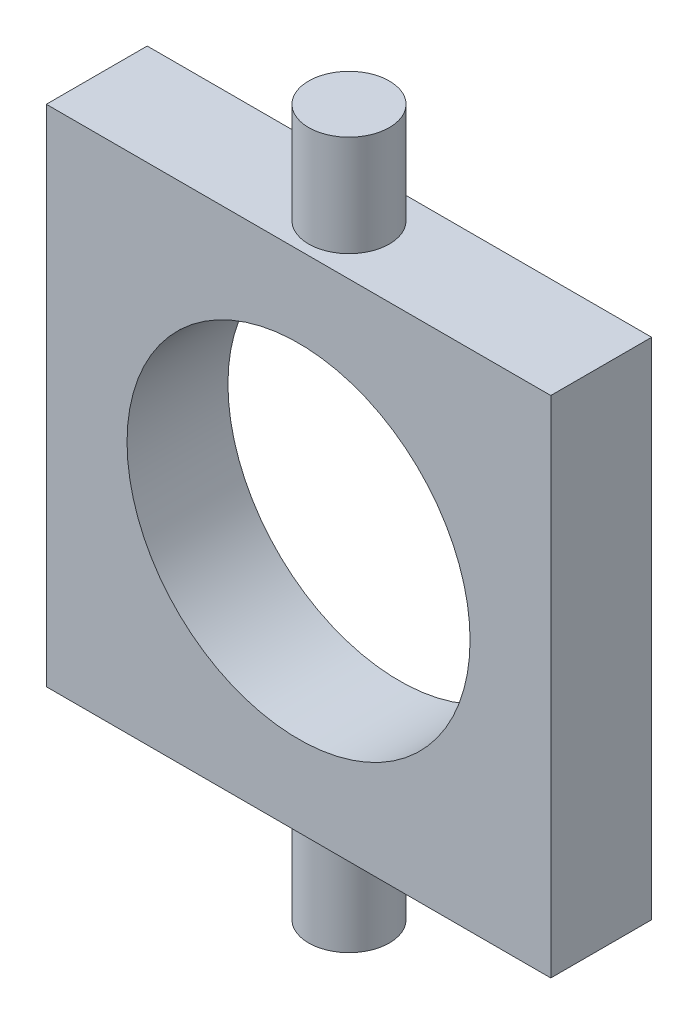
ISO-10303-21;
HEADER;
FILE_DESCRIPTION(('STEP AP214'),'2;1');
FILE_NAME('part.step','',(''),(''),'','','');
FILE_SCHEMA(('AUTOMOTIVE_DESIGN { 1 0 10303 214 1 1 1 1 }'));
ENDSEC;
DATA;
#1=APPLICATION_CONTEXT('core data for automotive mechanical design processes');
#2=APPLICATION_PROTOCOL_DEFINITION('international standard','automotive_design',2000,#1);
#3=PRODUCT_CONTEXT('',#1,'mechanical');
#4=PRODUCT('Part','Part','',(#3));
#5=PRODUCT_RELATED_PRODUCT_CATEGORY('part','',(#4));
#6=PRODUCT_DEFINITION_FORMATION('','',#4);
#7=PRODUCT_DEFINITION_CONTEXT('part definition',#1,'design');
#8=PRODUCT_DEFINITION('design','',#6,#7);
#9=PRODUCT_DEFINITION_SHAPE('','',#8);
#10=(LENGTH_UNIT() NAMED_UNIT(*) SI_UNIT(.MILLI.,.METRE.));
#11=(NAMED_UNIT(*) PLANE_ANGLE_UNIT() SI_UNIT($,.RADIAN.));
#12=(NAMED_UNIT(*) SI_UNIT($,.STERADIAN.) SOLID_ANGLE_UNIT());
#13=UNCERTAINTY_MEASURE_WITH_UNIT(LENGTH_MEASURE(1.E-05),#10,'distance_accuracy_value','');
#14=(GEOMETRIC_REPRESENTATION_CONTEXT(3) GLOBAL_UNCERTAINTY_ASSIGNED_CONTEXT((#13)) GLOBAL_UNIT_ASSIGNED_CONTEXT((#10,
#11,#12)) REPRESENTATION_CONTEXT('',''));
#15=CARTESIAN_POINT('',(0.,0.,0.));
#16=DIRECTION('',(0.,0.,1.));
#17=DIRECTION('',(1.,0.,0.));
#18=AXIS2_PLACEMENT_3D('',#15,#16,#17);
#19=CARTESIAN_POINT('',(25.,25.,10.));
#20=DIRECTION('',(-1.,0.,0.));
#21=DIRECTION('',(0.,-1.,0.));
#22=AXIS2_PLACEMENT_3D('',#19,#20,#21);
#23=PLANE('',#22);
#24=DIRECTION('',(0.,1.,0.));
#25=VECTOR('',#24,1.);
#26=CARTESIAN_POINT('',(25.,25.,0.));
#27=LINE('',#26,#25);
#28=CARTESIAN_POINT('',(25.,-25.,0.));
#29=VERTEX_POINT('',#28);
#30=CARTESIAN_POINT('',(25.,25.,0.));
#31=VERTEX_POINT('',#30);
#32=EDGE_CURVE('E99',#29,#31,#27,.T.);
#33=ORIENTED_EDGE('',*,*,#32,.T.);
#34=DIRECTION('',(0.,0.,-1.));
#35=VECTOR('',#34,1.);
#36=CARTESIAN_POINT('',(25.,25.,10.));
#37=LINE('',#36,#35);
#38=CARTESIAN_POINT('',(25.,25.,10.));
#39=VERTEX_POINT('',#38);
#40=EDGE_CURVE('E36',#39,#31,#37,.T.);
#41=ORIENTED_EDGE('',*,*,#40,.F.);
#42=DIRECTION('',(0.,1.,0.));
#43=VECTOR('',#42,1.);
#44=CARTESIAN_POINT('',(25.,25.,10.));
#45=LINE('',#44,#43);
#46=CARTESIAN_POINT('',(25.,-25.,10.));
#47=VERTEX_POINT('',#46);
#48=EDGE_CURVE('E86',#47,#39,#45,.T.);
#49=ORIENTED_EDGE('',*,*,#48,.F.);
#50=DIRECTION('',(0.,0.,-1.));
#51=VECTOR('',#50,1.);
#52=CARTESIAN_POINT('',(25.,-25.,10.));
#53=LINE('',#52,#51);
#54=EDGE_CURVE('E95',#47,#29,#53,.T.);
#55=ORIENTED_EDGE('',*,*,#54,.T.);
#56=EDGE_LOOP('',(#33,#41,#49,#55));
#57=FACE_BOUND('',#56,.T.);
#58=ADVANCED_FACE('F33',(#57),#23,.F.);
#59=CARTESIAN_POINT('',(-25.,25.,10.));
#60=DIRECTION('',(0.,-1.,0.));
#61=DIRECTION('',(0.,0.,-1.));
#62=AXIS2_PLACEMENT_3D('',#59,#60,#61);
#63=PLANE('',#62);
#64=CARTESIAN_POINT('',(0.,25.,5.));
#65=DIRECTION('',(0.,1.,0.));
#66=DIRECTION('',(0.,0.,1.));
#67=AXIS2_PLACEMENT_3D('',#64,#65,#66);
#68=CIRCLE('',#67,4.);
#69=CARTESIAN_POINT('',(0.,25.,9.));
#70=VERTEX_POINT('',#69);
#71=EDGE_CURVE('E11',#70,#70,#68,.T.);
#72=ORIENTED_EDGE('',*,*,#71,.F.);
#73=EDGE_LOOP('',(#72));
#74=FACE_BOUND('',#73,.T.);
#75=DIRECTION('',(-1.,0.,0.));
#76=VECTOR('',#75,1.);
#77=CARTESIAN_POINT('',(-25.,25.,0.));
#78=LINE('',#77,#76);
#79=CARTESIAN_POINT('',(-25.,25.,0.));
#80=VERTEX_POINT('',#79);
#81=EDGE_CURVE('E91',#31,#80,#78,.T.);
#82=ORIENTED_EDGE('',*,*,#81,.T.);
#83=DIRECTION('',(0.,0.,-1.));
#84=VECTOR('',#83,1.);
#85=CARTESIAN_POINT('',(-25.,25.,10.));
#86=LINE('',#85,#84);
#87=CARTESIAN_POINT('',(-25.,25.,10.));
#88=VERTEX_POINT('',#87);
#89=EDGE_CURVE('E89',#88,#80,#86,.T.);
#90=ORIENTED_EDGE('',*,*,#89,.F.);
#91=DIRECTION('',(-1.,0.,0.));
#92=VECTOR('',#91,1.);
#93=CARTESIAN_POINT('',(-25.,25.,10.));
#94=LINE('',#93,#92);
#95=EDGE_CURVE('E81',#39,#88,#94,.T.);
#96=ORIENTED_EDGE('',*,*,#95,.F.);
#97=ORIENTED_EDGE('',*,*,#40,.T.);
#98=EDGE_LOOP('',(#82,#90,#96,#97));
#99=FACE_BOUND('',#98,.T.);
#100=ADVANCED_FACE('F90',(#74,#99),#63,.F.);
#101=CARTESIAN_POINT('',(-25.,25.,10.));
#102=DIRECTION('',(1.,0.,0.));
#103=DIRECTION('',(0.,1.,0.));
#104=AXIS2_PLACEMENT_3D('',#101,#102,#103);
#105=PLANE('',#104);
#106=DIRECTION('',(0.,-1.,0.));
#107=VECTOR('',#106,1.);
#108=CARTESIAN_POINT('',(-25.,25.,0.));
#109=LINE('',#108,#107);
#110=CARTESIAN_POINT('',(-25.,-25.,0.));
#111=VERTEX_POINT('',#110);
#112=EDGE_CURVE('E67',#80,#111,#109,.T.);
#113=ORIENTED_EDGE('',*,*,#112,.T.);
#114=DIRECTION('',(0.,0.,-1.));
#115=VECTOR('',#114,1.);
#116=CARTESIAN_POINT('',(-25.,-25.,10.));
#117=LINE('',#116,#115);
#118=CARTESIAN_POINT('',(-25.,-25.,10.));
#119=VERTEX_POINT('',#118);
#120=EDGE_CURVE('E92',#119,#111,#117,.T.);
#121=ORIENTED_EDGE('',*,*,#120,.F.);
#122=DIRECTION('',(0.,-1.,0.));
#123=VECTOR('',#122,1.);
#124=CARTESIAN_POINT('',(-25.,25.,10.));
#125=LINE('',#124,#123);
#126=EDGE_CURVE('E84',#88,#119,#125,.T.);
#127=ORIENTED_EDGE('',*,*,#126,.F.);
#128=ORIENTED_EDGE('',*,*,#89,.T.);
#129=EDGE_LOOP('',(#113,#121,#127,#128));
#130=FACE_BOUND('',#129,.T.);
#131=ADVANCED_FACE('F93',(#130),#105,.F.);
#132=CARTESIAN_POINT('',(-25.,-25.,10.));
#133=DIRECTION('',(0.,1.,0.));
#134=DIRECTION('',(0.,0.,1.));
#135=AXIS2_PLACEMENT_3D('',#132,#133,#134);
#136=PLANE('',#135);
#137=CARTESIAN_POINT('',(0.,-25.,5.));
#138=DIRECTION('',(0.,1.,0.));
#139=DIRECTION('',(0.,0.,1.));
#140=AXIS2_PLACEMENT_3D('',#137,#138,#139);
#141=CIRCLE('',#140,4.);
#142=CARTESIAN_POINT('',(0.,-25.,9.));
#143=VERTEX_POINT('',#142);
#144=EDGE_CURVE('E122',#143,#143,#141,.T.);
#145=ORIENTED_EDGE('',*,*,#144,.T.);
#146=EDGE_LOOP('',(#145));
#147=FACE_BOUND('',#146,.T.);
#148=DIRECTION('',(1.,0.,0.));
#149=VECTOR('',#148,1.);
#150=CARTESIAN_POINT('',(-25.,-25.,0.));
#151=LINE('',#150,#149);
#152=EDGE_CURVE('E73',#111,#29,#151,.T.);
#153=ORIENTED_EDGE('',*,*,#152,.T.);
#154=ORIENTED_EDGE('',*,*,#54,.F.);
#155=DIRECTION('',(1.,0.,0.));
#156=VECTOR('',#155,1.);
#157=CARTESIAN_POINT('',(-25.,-25.,10.));
#158=LINE('',#157,#156);
#159=EDGE_CURVE('E50',#119,#47,#158,.T.);
#160=ORIENTED_EDGE('',*,*,#159,.F.);
#161=ORIENTED_EDGE('',*,*,#120,.T.);
#162=EDGE_LOOP('',(#153,#154,#160,#161));
#163=FACE_BOUND('',#162,.T.);
#164=ADVANCED_FACE('F107',(#147,#163),#136,.F.);
#165=CARTESIAN_POINT('',(0.,0.,10.));
#166=DIRECTION('',(0.,0.,1.));
#167=DIRECTION('',(1.,0.,0.));
#168=AXIS2_PLACEMENT_3D('',#165,#166,#167);
#169=PLANE('',#168);
#170=CARTESIAN_POINT('',(0.,0.,10.));
#171=DIRECTION('',(0.,0.,1.));
#172=DIRECTION('',(1.,0.,0.));
#173=AXIS2_PLACEMENT_3D('',#170,#171,#172);
#174=CIRCLE('',#173,17.);
#175=CARTESIAN_POINT('',(17.,0.,10.));
#176=VERTEX_POINT('',#175);
#177=EDGE_CURVE('E113',#176,#176,#174,.T.);
#178=ORIENTED_EDGE('',*,*,#177,.F.);
#179=EDGE_LOOP('',(#178));
#180=FACE_BOUND('',#179,.T.);
#181=ORIENTED_EDGE('',*,*,#48,.T.);
#182=ORIENTED_EDGE('',*,*,#95,.T.);
#183=ORIENTED_EDGE('',*,*,#126,.T.);
#184=ORIENTED_EDGE('',*,*,#159,.T.);
#185=EDGE_LOOP('',(#181,#182,#183,#184));
#186=FACE_BOUND('',#185,.T.);
#187=ADVANCED_FACE('F82',(#180,#186),#169,.T.);
#188=CARTESIAN_POINT('',(0.,0.,0.));
#189=DIRECTION('',(0.,0.,1.));
#190=DIRECTION('',(1.,0.,0.));
#191=AXIS2_PLACEMENT_3D('',#188,#189,#190);
#192=PLANE('',#191);
#193=CARTESIAN_POINT('',(0.,0.,0.));
#194=DIRECTION('',(0.,0.,1.));
#195=DIRECTION('',(1.,0.,0.));
#196=AXIS2_PLACEMENT_3D('',#193,#194,#195);
#197=CIRCLE('',#196,17.);
#198=CARTESIAN_POINT('',(17.,0.,0.));
#199=VERTEX_POINT('',#198);
#200=EDGE_CURVE('E102',#199,#199,#197,.T.);
#201=ORIENTED_EDGE('',*,*,#200,.T.);
#202=EDGE_LOOP('',(#201));
#203=FACE_BOUND('',#202,.T.);
#204=ORIENTED_EDGE('',*,*,#32,.F.);
#205=ORIENTED_EDGE('',*,*,#152,.F.);
#206=ORIENTED_EDGE('',*,*,#112,.F.);
#207=ORIENTED_EDGE('',*,*,#81,.F.);
#208=EDGE_LOOP('',(#204,#205,#206,#207));
#209=FACE_BOUND('',#208,.T.);
#210=ADVANCED_FACE('F110',(#203,#209),#192,.F.);
#211=CARTESIAN_POINT('',(0.,0.,0.));
#212=DIRECTION('',(0.,0.,1.));
#213=DIRECTION('',(1.,0.,0.));
#214=AXIS2_PLACEMENT_3D('',#211,#212,#213);
#215=CYLINDRICAL_SURFACE('',#214,17.);
#216=ORIENTED_EDGE('',*,*,#200,.F.);
#217=EDGE_LOOP('',(#216));
#218=FACE_BOUND('',#217,.T.);
#219=ORIENTED_EDGE('',*,*,#177,.T.);
#220=EDGE_LOOP('',(#219));
#221=FACE_BOUND('',#220,.T.);
#222=ADVANCED_FACE('F155',(#218,#221),#215,.F.);
#223=CARTESIAN_POINT('',(0.,35.,5.));
#224=DIRECTION('',(0.,-1.,0.));
#225=DIRECTION('',(0.,0.,-1.));
#226=AXIS2_PLACEMENT_3D('',#223,#224,#225);
#227=CYLINDRICAL_SURFACE('',#226,4.);
#228=CARTESIAN_POINT('',(0.,35.,5.));
#229=DIRECTION('',(0.,1.,0.));
#230=DIRECTION('',(0.,0.,1.));
#231=AXIS2_PLACEMENT_3D('',#228,#229,#230);
#232=CIRCLE('',#231,4.);
#233=CARTESIAN_POINT('',(0.,35.,9.));
#234=VERTEX_POINT('',#233);
#235=EDGE_CURVE('E116',#234,#234,#232,.T.);
#236=ORIENTED_EDGE('',*,*,#235,.F.);
#237=EDGE_LOOP('',(#236));
#238=FACE_BOUND('',#237,.T.);
#239=ORIENTED_EDGE('',*,*,#71,.T.);
#240=EDGE_LOOP('',(#239));
#241=FACE_BOUND('',#240,.T.);
#242=ADVANCED_FACE('F162',(#238,#241),#227,.T.);
#243=CARTESIAN_POINT('',(0.,35.,5.));
#244=DIRECTION('',(0.,1.,0.));
#245=DIRECTION('',(0.,0.,1.));
#246=AXIS2_PLACEMENT_3D('',#243,#244,#245);
#247=PLANE('',#246);
#248=ORIENTED_EDGE('',*,*,#235,.T.);
#249=EDGE_LOOP('',(#248));
#250=FACE_BOUND('',#249,.T.);
#251=ADVANCED_FACE('F137',(#250),#247,.T.);
#252=CARTESIAN_POINT('',(0.,-35.,5.));
#253=DIRECTION('',(0.,1.,0.));
#254=DIRECTION('',(0.,0.,1.));
#255=AXIS2_PLACEMENT_3D('',#252,#253,#254);
#256=CYLINDRICAL_SURFACE('',#255,4.);
#257=CARTESIAN_POINT('',(0.,-35.,5.));
#258=DIRECTION('',(0.,1.,0.));
#259=DIRECTION('',(0.,0.,1.));
#260=AXIS2_PLACEMENT_3D('',#257,#258,#259);
#261=CIRCLE('',#260,4.);
#262=CARTESIAN_POINT('',(0.,-35.,9.));
#263=VERTEX_POINT('',#262);
#264=EDGE_CURVE('E121',#263,#263,#261,.T.);
#265=ORIENTED_EDGE('',*,*,#264,.T.);
#266=EDGE_LOOP('',(#265));
#267=FACE_BOUND('',#266,.T.);
#268=ORIENTED_EDGE('',*,*,#144,.F.);
#269=EDGE_LOOP('',(#268));
#270=FACE_BOUND('',#269,.T.);
#271=ADVANCED_FACE('F128',(#267,#270),#256,.T.);
#272=CARTESIAN_POINT('',(0.,-35.,5.));
#273=DIRECTION('',(0.,-1.,0.));
#274=DIRECTION('',(0.,0.,1.));
#275=AXIS2_PLACEMENT_3D('',#272,#273,#274);
#276=PLANE('',#275);
#277=ORIENTED_EDGE('',*,*,#264,.F.);
#278=EDGE_LOOP('',(#277));
#279=FACE_BOUND('',#278,.T.);
#280=ADVANCED_FACE('F131',(#279),#276,.T.);
#281=CLOSED_SHELL('',(#58,#100,#131,#164,#187,#210,#222,#242,#251,#271,#280));
#282=MANIFOLD_SOLID_BREP('B2',#281);
#283=ADVANCED_BREP_SHAPE_REPRESENTATION('',(#18,#282),#14);
#284=SHAPE_DEFINITION_REPRESENTATION(#9,#283);
ENDSEC;
END-ISO-10303-21;
